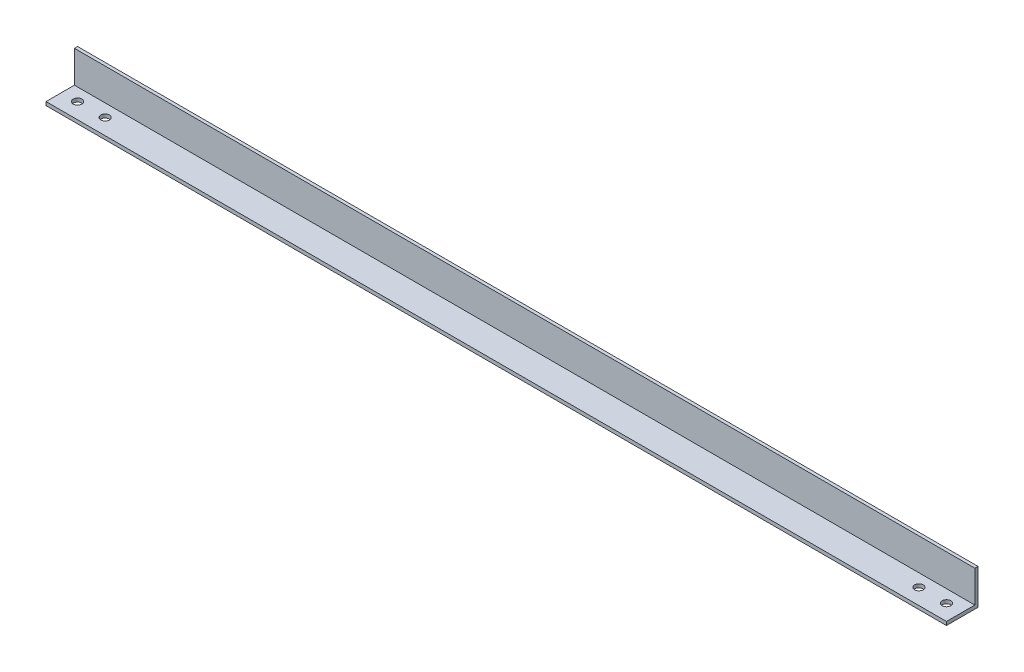
ISO-10303-21;
HEADER;
FILE_DESCRIPTION(('STEP AP214'),'2;1');
FILE_NAME('part.step','',(''),(''),'','','');
FILE_SCHEMA(('AUTOMOTIVE_DESIGN { 1 0 10303 214 1 1 1 1 }'));
ENDSEC;
DATA;
#1=APPLICATION_CONTEXT('core data for automotive mechanical design processes');
#2=APPLICATION_PROTOCOL_DEFINITION('international standard','automotive_design',2000,#1);
#3=PRODUCT_CONTEXT('',#1,'mechanical');
#4=PRODUCT('Part','Part','',(#3));
#5=PRODUCT_RELATED_PRODUCT_CATEGORY('part','',(#4));
#6=PRODUCT_DEFINITION_FORMATION('','',#4);
#7=PRODUCT_DEFINITION_CONTEXT('part definition',#1,'design');
#8=PRODUCT_DEFINITION('design','',#6,#7);
#9=PRODUCT_DEFINITION_SHAPE('','',#8);
#10=(LENGTH_UNIT() NAMED_UNIT(*) SI_UNIT(.MILLI.,.METRE.));
#11=(NAMED_UNIT(*) PLANE_ANGLE_UNIT() SI_UNIT($,.RADIAN.));
#12=(NAMED_UNIT(*) SI_UNIT($,.STERADIAN.) SOLID_ANGLE_UNIT());
#13=UNCERTAINTY_MEASURE_WITH_UNIT(LENGTH_MEASURE(1.E-05),#10,'distance_accuracy_value','');
#14=(GEOMETRIC_REPRESENTATION_CONTEXT(3) GLOBAL_UNCERTAINTY_ASSIGNED_CONTEXT((#13)) GLOBAL_UNIT_ASSIGNED_CONTEXT((#10,
#11,#12)) REPRESENTATION_CONTEXT('',''));
#15=CARTESIAN_POINT('',(0.,0.,0.));
#16=DIRECTION('',(0.,0.,1.));
#17=DIRECTION('',(1.,0.,0.));
#18=AXIS2_PLACEMENT_3D('',#15,#16,#17);
#19=CARTESIAN_POINT('',(0.,0.,8.));
#20=DIRECTION('',(0.,0.,-1.));
#21=DIRECTION('',(-1.,0.,0.));
#22=AXIS2_PLACEMENT_3D('',#19,#20,#21);
#23=PLANE('',#22);
#24=DIRECTION('',(-1.,0.,0.));
#25=VECTOR('',#24,1.);
#26=CARTESIAN_POINT('',(0.,9.,8.));
#27=LINE('',#26,#25);
#28=CARTESIAN_POINT('',(2284.,8.99999999999999,8.));
#29=VERTEX_POINT('',#28);
#30=CARTESIAN_POINT('',(0.,9.,8.));
#31=VERTEX_POINT('',#30);
#32=EDGE_CURVE('E51',#29,#31,#27,.T.);
#33=ORIENTED_EDGE('',*,*,#32,.F.);
#34=DIRECTION('',(0.,1.,0.));
#35=VECTOR('',#34,1.);
#36=CARTESIAN_POINT('',(2284.,0.,8.));
#37=LINE('',#36,#35);
#38=CARTESIAN_POINT('',(2284.,90.,8.));
#39=VERTEX_POINT('',#38);
#40=EDGE_CURVE('E111',#29,#39,#37,.T.);
#41=ORIENTED_EDGE('',*,*,#40,.T.);
#42=DIRECTION('',(-1.,0.,0.));
#43=VECTOR('',#42,1.);
#44=CARTESIAN_POINT('',(0.,90.,8.));
#45=LINE('',#44,#43);
#46=CARTESIAN_POINT('',(0.,90.,8.));
#47=VERTEX_POINT('',#46);
#48=EDGE_CURVE('E57',#39,#47,#45,.T.);
#49=ORIENTED_EDGE('',*,*,#48,.T.);
#50=DIRECTION('',(0.,-1.,0.));
#51=VECTOR('',#50,1.);
#52=CARTESIAN_POINT('',(0.,0.,8.));
#53=LINE('',#52,#51);
#54=EDGE_CURVE('E86',#47,#31,#53,.T.);
#55=ORIENTED_EDGE('',*,*,#54,.T.);
#56=EDGE_LOOP('',(#33,#41,#49,#55));
#57=FACE_BOUND('',#56,.T.);
#58=ADVANCED_FACE('F34',(#57),#23,.F.);
#59=CARTESIAN_POINT('',(0.,0.,8.));
#60=DIRECTION('',(1.,0.,0.));
#61=DIRECTION('',(0.,0.,-1.));
#62=AXIS2_PLACEMENT_3D('',#59,#60,#61);
#63=PLANE('',#62);
#64=DIRECTION('',(0.,-1.,0.));
#65=VECTOR('',#64,1.);
#66=CARTESIAN_POINT('',(0.,0.,0.));
#67=LINE('',#66,#65);
#68=CARTESIAN_POINT('',(0.,90.,0.));
#69=VERTEX_POINT('',#68);
#70=CARTESIAN_POINT('',(0.,0.,0.));
#71=VERTEX_POINT('',#70);
#72=EDGE_CURVE('E92',#69,#71,#67,.T.);
#73=ORIENTED_EDGE('',*,*,#72,.T.);
#74=DIRECTION('',(0.,0.,-1.));
#75=VECTOR('',#74,1.);
#76=CARTESIAN_POINT('',(0.,0.,8.));
#77=LINE('',#76,#75);
#78=CARTESIAN_POINT('',(0.,0.,80.));
#79=VERTEX_POINT('',#78);
#80=EDGE_CURVE('E11',#79,#71,#77,.T.);
#81=ORIENTED_EDGE('',*,*,#80,.F.);
#82=DIRECTION('',(0.,-1.,0.));
#83=VECTOR('',#82,1.);
#84=CARTESIAN_POINT('',(0.,0.,80.));
#85=LINE('',#84,#83);
#86=CARTESIAN_POINT('',(0.,9.,80.));
#87=VERTEX_POINT('',#86);
#88=EDGE_CURVE('E121',#87,#79,#85,.T.);
#89=ORIENTED_EDGE('',*,*,#88,.F.);
#90=DIRECTION('',(0.,0.,-1.));
#91=VECTOR('',#90,1.);
#92=CARTESIAN_POINT('',(0.,9.,80.));
#93=LINE('',#92,#91);
#94=EDGE_CURVE('E101',#87,#31,#93,.T.);
#95=ORIENTED_EDGE('',*,*,#94,.T.);
#96=ORIENTED_EDGE('',*,*,#54,.F.);
#97=DIRECTION('',(0.,0.,-1.));
#98=VECTOR('',#97,1.);
#99=CARTESIAN_POINT('',(0.,90.,8.));
#100=LINE('',#99,#98);
#101=EDGE_CURVE('E79',#47,#69,#100,.T.);
#102=ORIENTED_EDGE('',*,*,#101,.T.);
#103=EDGE_LOOP('',(#73,#81,#89,#95,#96,#102));
#104=FACE_BOUND('',#103,.T.);
#105=ADVANCED_FACE('F36',(#104),#63,.F.);
#106=CARTESIAN_POINT('',(0.,0.,8.));
#107=DIRECTION('',(0.,1.,0.));
#108=DIRECTION('',(0.,0.,1.));
#109=AXIS2_PLACEMENT_3D('',#106,#107,#108);
#110=PLANE('',#109);
#111=CARTESIAN_POINT('',(2244.05,0.,40.));
#112=DIRECTION('',(0.,1.,0.));
#113=DIRECTION('',(0.,0.,1.));
#114=AXIS2_PLACEMENT_3D('',#111,#112,#113);
#115=CIRCLE('',#114,11.0000000000001);
#116=CARTESIAN_POINT('',(2244.05,0.,51.0000000000002));
#117=VERTEX_POINT('',#116);
#118=EDGE_CURVE('E157',#117,#117,#115,.T.);
#119=ORIENTED_EDGE('',*,*,#118,.T.);
#120=EDGE_LOOP('',(#119));
#121=FACE_BOUND('',#120,.T.);
#122=CARTESIAN_POINT('',(2174.05,0.,40.));
#123=DIRECTION('',(0.,1.,0.));
#124=DIRECTION('',(0.,0.,1.));
#125=AXIS2_PLACEMENT_3D('',#122,#123,#124);
#126=CIRCLE('',#125,11.0000000000001);
#127=CARTESIAN_POINT('',(2174.05,0.,51.0000000000001));
#128=VERTEX_POINT('',#127);
#129=EDGE_CURVE('E151',#128,#128,#126,.T.);
#130=ORIENTED_EDGE('',*,*,#129,.T.);
#131=EDGE_LOOP('',(#130));
#132=FACE_BOUND('',#131,.T.);
#133=CARTESIAN_POINT('',(109.95,0.,40.));
#134=DIRECTION('',(0.,1.,0.));
#135=DIRECTION('',(0.,0.,1.));
#136=AXIS2_PLACEMENT_3D('',#133,#134,#135);
#137=CIRCLE('',#136,11.);
#138=CARTESIAN_POINT('',(109.95,0.,51.));
#139=VERTEX_POINT('',#138);
#140=EDGE_CURVE('E145',#139,#139,#137,.T.);
#141=ORIENTED_EDGE('',*,*,#140,.T.);
#142=EDGE_LOOP('',(#141));
#143=FACE_BOUND('',#142,.T.);
#144=CARTESIAN_POINT('',(39.95,0.,40.));
#145=DIRECTION('',(0.,1.,0.));
#146=DIRECTION('',(0.,0.,1.));
#147=AXIS2_PLACEMENT_3D('',#144,#145,#146);
#148=CIRCLE('',#147,11.);
#149=CARTESIAN_POINT('',(39.95,0.,51.));
#150=VERTEX_POINT('',#149);
#151=EDGE_CURVE('E122',#150,#150,#148,.T.);
#152=ORIENTED_EDGE('',*,*,#151,.T.);
#153=EDGE_LOOP('',(#152));
#154=FACE_BOUND('',#153,.T.);
#155=DIRECTION('',(1.,0.,0.));
#156=VECTOR('',#155,1.);
#157=CARTESIAN_POINT('',(0.,0.,0.));
#158=LINE('',#157,#156);
#159=CARTESIAN_POINT('',(2284.,0.,0.));
#160=VERTEX_POINT('',#159);
#161=EDGE_CURVE('E96',#71,#160,#158,.T.);
#162=ORIENTED_EDGE('',*,*,#161,.T.);
#163=DIRECTION('',(0.,0.,-1.));
#164=VECTOR('',#163,1.);
#165=CARTESIAN_POINT('',(2284.,0.,8.));
#166=LINE('',#165,#164);
#167=CARTESIAN_POINT('',(2284.,0.,80.));
#168=VERTEX_POINT('',#167);
#169=EDGE_CURVE('E43',#168,#160,#166,.T.);
#170=ORIENTED_EDGE('',*,*,#169,.F.);
#171=DIRECTION('',(1.,0.,0.));
#172=VECTOR('',#171,1.);
#173=CARTESIAN_POINT('',(0.,0.,80.));
#174=LINE('',#173,#172);
#175=EDGE_CURVE('E134',#79,#168,#174,.T.);
#176=ORIENTED_EDGE('',*,*,#175,.F.);
#177=ORIENTED_EDGE('',*,*,#80,.T.);
#178=EDGE_LOOP('',(#162,#170,#176,#177));
#179=FACE_BOUND('',#178,.T.);
#180=ADVANCED_FACE('F166',(#121,#132,#143,#154,#179),#110,.F.);
#181=CARTESIAN_POINT('',(2284.,0.,8.));
#182=DIRECTION('',(-1.,0.,0.));
#183=DIRECTION('',(0.,0.,1.));
#184=AXIS2_PLACEMENT_3D('',#181,#182,#183);
#185=PLANE('',#184);
#186=DIRECTION('',(0.,1.,0.));
#187=VECTOR('',#186,1.);
#188=CARTESIAN_POINT('',(2284.,0.,0.));
#189=LINE('',#188,#187);
#190=CARTESIAN_POINT('',(2284.,90.,0.));
#191=VERTEX_POINT('',#190);
#192=EDGE_CURVE('E87',#160,#191,#189,.T.);
#193=ORIENTED_EDGE('',*,*,#192,.T.);
#194=DIRECTION('',(0.,0.,-1.));
#195=VECTOR('',#194,1.);
#196=CARTESIAN_POINT('',(2284.,90.,8.));
#197=LINE('',#196,#195);
#198=EDGE_CURVE('E82',#39,#191,#197,.T.);
#199=ORIENTED_EDGE('',*,*,#198,.F.);
#200=ORIENTED_EDGE('',*,*,#40,.F.);
#201=DIRECTION('',(0.,0.,-1.));
#202=VECTOR('',#201,1.);
#203=CARTESIAN_POINT('',(2284.,9.,80.));
#204=LINE('',#203,#202);
#205=CARTESIAN_POINT('',(2284.,9.,80.));
#206=VERTEX_POINT('',#205);
#207=EDGE_CURVE('E97',#206,#29,#204,.T.);
#208=ORIENTED_EDGE('',*,*,#207,.F.);
#209=DIRECTION('',(0.,1.,0.));
#210=VECTOR('',#209,1.);
#211=CARTESIAN_POINT('',(2284.,0.,80.));
#212=LINE('',#211,#210);
#213=EDGE_CURVE('E129',#168,#206,#212,.T.);
#214=ORIENTED_EDGE('',*,*,#213,.F.);
#215=ORIENTED_EDGE('',*,*,#169,.T.);
#216=EDGE_LOOP('',(#193,#199,#200,#208,#214,#215));
#217=FACE_BOUND('',#216,.T.);
#218=ADVANCED_FACE('F197',(#217),#185,.F.);
#219=CARTESIAN_POINT('',(0.,90.,8.));
#220=DIRECTION('',(0.,-1.,0.));
#221=DIRECTION('',(1.,0.,0.));
#222=AXIS2_PLACEMENT_3D('',#219,#220,#221);
#223=PLANE('',#222);
#224=DIRECTION('',(-1.,0.,0.));
#225=VECTOR('',#224,1.);
#226=CARTESIAN_POINT('',(0.,90.,0.));
#227=LINE('',#226,#225);
#228=EDGE_CURVE('E76',#191,#69,#227,.T.);
#229=ORIENTED_EDGE('',*,*,#228,.T.);
#230=ORIENTED_EDGE('',*,*,#101,.F.);
#231=ORIENTED_EDGE('',*,*,#48,.F.);
#232=ORIENTED_EDGE('',*,*,#198,.T.);
#233=EDGE_LOOP('',(#229,#230,#231,#232));
#234=FACE_BOUND('',#233,.T.);
#235=ADVANCED_FACE('F78',(#234),#223,.F.);
#236=CARTESIAN_POINT('',(0.,0.,0.));
#237=DIRECTION('',(0.,0.,-1.));
#238=DIRECTION('',(-1.,0.,0.));
#239=AXIS2_PLACEMENT_3D('',#236,#237,#238);
#240=PLANE('',#239);
#241=ORIENTED_EDGE('',*,*,#72,.F.);
#242=ORIENTED_EDGE('',*,*,#228,.F.);
#243=ORIENTED_EDGE('',*,*,#192,.F.);
#244=ORIENTED_EDGE('',*,*,#161,.F.);
#245=EDGE_LOOP('',(#241,#242,#243,#244));
#246=FACE_BOUND('',#245,.T.);
#247=ADVANCED_FACE('F95',(#246),#240,.T.);
#248=CARTESIAN_POINT('',(0.,9.,80.));
#249=DIRECTION('',(0.,-1.,0.));
#250=DIRECTION('',(0.,0.,-1.));
#251=AXIS2_PLACEMENT_3D('',#248,#249,#250);
#252=PLANE('',#251);
#253=CARTESIAN_POINT('',(2244.05,9.,40.));
#254=DIRECTION('',(0.,1.,0.));
#255=DIRECTION('',(0.,0.,1.));
#256=AXIS2_PLACEMENT_3D('',#253,#254,#255);
#257=CIRCLE('',#256,11.0000000000001);
#258=CARTESIAN_POINT('',(2244.05,9.,51.0000000000002));
#259=VERTEX_POINT('',#258);
#260=EDGE_CURVE('E160',#259,#259,#257,.T.);
#261=ORIENTED_EDGE('',*,*,#260,.F.);
#262=EDGE_LOOP('',(#261));
#263=FACE_BOUND('',#262,.T.);
#264=CARTESIAN_POINT('',(2174.05,9.,40.));
#265=DIRECTION('',(0.,1.,0.));
#266=DIRECTION('',(0.,0.,1.));
#267=AXIS2_PLACEMENT_3D('',#264,#265,#266);
#268=CIRCLE('',#267,11.0000000000001);
#269=CARTESIAN_POINT('',(2174.05,9.,51.0000000000001));
#270=VERTEX_POINT('',#269);
#271=EDGE_CURVE('E154',#270,#270,#268,.T.);
#272=ORIENTED_EDGE('',*,*,#271,.F.);
#273=EDGE_LOOP('',(#272));
#274=FACE_BOUND('',#273,.T.);
#275=CARTESIAN_POINT('',(109.95,9.,40.));
#276=DIRECTION('',(0.,1.,0.));
#277=DIRECTION('',(0.,0.,1.));
#278=AXIS2_PLACEMENT_3D('',#275,#276,#277);
#279=CIRCLE('',#278,11.);
#280=CARTESIAN_POINT('',(109.95,9.,51.));
#281=VERTEX_POINT('',#280);
#282=EDGE_CURVE('E148',#281,#281,#279,.T.);
#283=ORIENTED_EDGE('',*,*,#282,.F.);
#284=EDGE_LOOP('',(#283));
#285=FACE_BOUND('',#284,.T.);
#286=CARTESIAN_POINT('',(39.95,9.,40.));
#287=DIRECTION('',(0.,1.,0.));
#288=DIRECTION('',(0.,0.,1.));
#289=AXIS2_PLACEMENT_3D('',#286,#287,#288);
#290=CIRCLE('',#289,11.);
#291=CARTESIAN_POINT('',(39.95,9.,51.));
#292=VERTEX_POINT('',#291);
#293=EDGE_CURVE('E142',#292,#292,#290,.T.);
#294=ORIENTED_EDGE('',*,*,#293,.F.);
#295=EDGE_LOOP('',(#294));
#296=FACE_BOUND('',#295,.T.);
#297=ORIENTED_EDGE('',*,*,#32,.T.);
#298=ORIENTED_EDGE('',*,*,#94,.F.);
#299=DIRECTION('',(-1.,0.,0.));
#300=VECTOR('',#299,1.);
#301=CARTESIAN_POINT('',(0.,9.,80.));
#302=LINE('',#301,#300);
#303=EDGE_CURVE('E118',#206,#87,#302,.T.);
#304=ORIENTED_EDGE('',*,*,#303,.F.);
#305=ORIENTED_EDGE('',*,*,#207,.T.);
#306=EDGE_LOOP('',(#297,#298,#304,#305));
#307=FACE_BOUND('',#306,.T.);
#308=ADVANCED_FACE('F176',(#263,#274,#285,#296,#307),#252,.F.);
#309=CARTESIAN_POINT('',(0.,9.,80.));
#310=DIRECTION('',(0.,0.,-1.));
#311=DIRECTION('',(-1.,0.,0.));
#312=AXIS2_PLACEMENT_3D('',#309,#310,#311);
#313=PLANE('',#312);
#314=ORIENTED_EDGE('',*,*,#88,.T.);
#315=ORIENTED_EDGE('',*,*,#175,.T.);
#316=ORIENTED_EDGE('',*,*,#213,.T.);
#317=ORIENTED_EDGE('',*,*,#303,.T.);
#318=EDGE_LOOP('',(#314,#315,#316,#317));
#319=FACE_BOUND('',#318,.T.);
#320=ADVANCED_FACE('F179',(#319),#313,.F.);
#321=CARTESIAN_POINT('',(39.95,0.,40.));
#322=DIRECTION('',(0.,1.,0.));
#323=DIRECTION('',(0.,0.,1.));
#324=AXIS2_PLACEMENT_3D('',#321,#322,#323);
#325=CYLINDRICAL_SURFACE('',#324,11.);
#326=ORIENTED_EDGE('',*,*,#151,.F.);
#327=EDGE_LOOP('',(#326));
#328=FACE_BOUND('',#327,.T.);
#329=ORIENTED_EDGE('',*,*,#293,.T.);
#330=EDGE_LOOP('',(#329));
#331=FACE_BOUND('',#330,.T.);
#332=ADVANCED_FACE('F238',(#328,#331),#325,.F.);
#333=CARTESIAN_POINT('',(109.95,0.,40.));
#334=DIRECTION('',(0.,1.,0.));
#335=DIRECTION('',(0.,0.,1.));
#336=AXIS2_PLACEMENT_3D('',#333,#334,#335);
#337=CYLINDRICAL_SURFACE('',#336,11.);
#338=ORIENTED_EDGE('',*,*,#140,.F.);
#339=EDGE_LOOP('',(#338));
#340=FACE_BOUND('',#339,.T.);
#341=ORIENTED_EDGE('',*,*,#282,.T.);
#342=EDGE_LOOP('',(#341));
#343=FACE_BOUND('',#342,.T.);
#344=ADVANCED_FACE('F243',(#340,#343),#337,.F.);
#345=CARTESIAN_POINT('',(2174.05,0.,40.));
#346=DIRECTION('',(0.,1.,0.));
#347=DIRECTION('',(0.,0.,1.));
#348=AXIS2_PLACEMENT_3D('',#345,#346,#347);
#349=CYLINDRICAL_SURFACE('',#348,11.0000000000001);
#350=ORIENTED_EDGE('',*,*,#129,.F.);
#351=EDGE_LOOP('',(#350));
#352=FACE_BOUND('',#351,.T.);
#353=ORIENTED_EDGE('',*,*,#271,.T.);
#354=EDGE_LOOP('',(#353));
#355=FACE_BOUND('',#354,.T.);
#356=ADVANCED_FACE('F172',(#352,#355),#349,.F.);
#357=CARTESIAN_POINT('',(2244.05,0.,40.));
#358=DIRECTION('',(0.,1.,0.));
#359=DIRECTION('',(0.,0.,1.));
#360=AXIS2_PLACEMENT_3D('',#357,#358,#359);
#361=CYLINDRICAL_SURFACE('',#360,11.0000000000001);
#362=ORIENTED_EDGE('',*,*,#118,.F.);
#363=EDGE_LOOP('',(#362));
#364=FACE_BOUND('',#363,.T.);
#365=ORIENTED_EDGE('',*,*,#260,.T.);
#366=EDGE_LOOP('',(#365));
#367=FACE_BOUND('',#366,.T.);
#368=ADVANCED_FACE('F169',(#364,#367),#361,.F.);
#369=CLOSED_SHELL('',(#58,#105,#180,#218,#235,#247,#308,#320,#332,#344,#356,#368));
#370=MANIFOLD_SOLID_BREP('B2',#369);
#371=ADVANCED_BREP_SHAPE_REPRESENTATION('',(#18,#370),#14);
#372=SHAPE_DEFINITION_REPRESENTATION(#9,#371);
ENDSEC;
END-ISO-10303-21;
